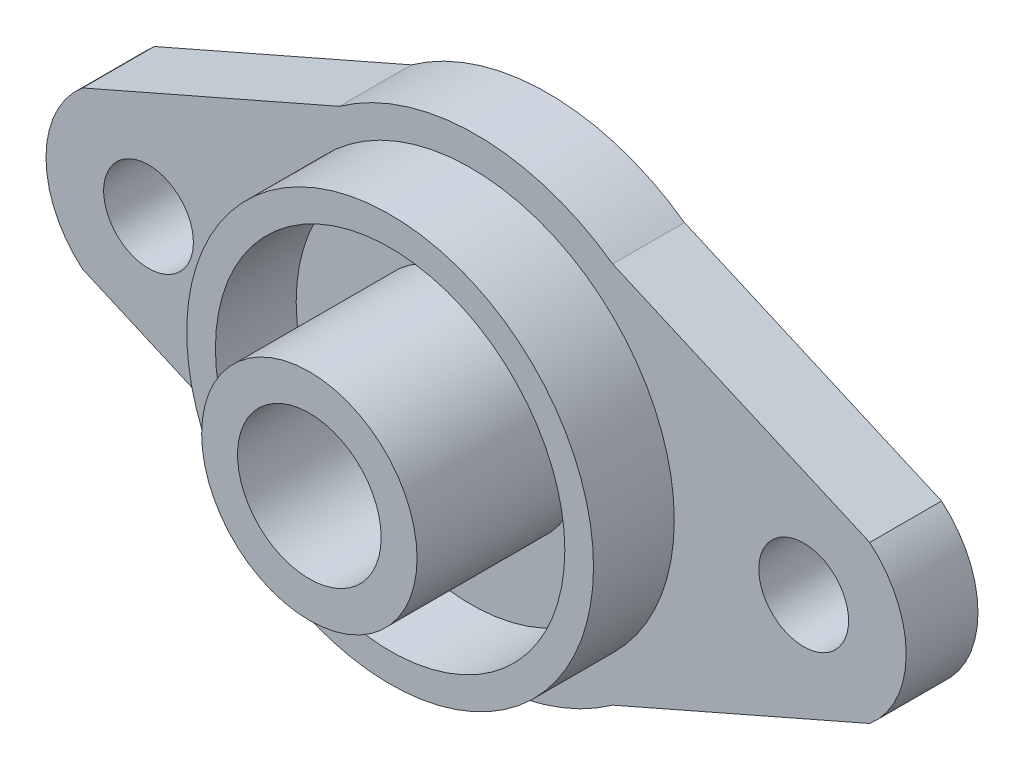
ISO-10303-21;
HEADER;
FILE_DESCRIPTION(('STEP AP214'),'2;1');
FILE_NAME('part.step','',(''),(''),'','','');
FILE_SCHEMA(('AUTOMOTIVE_DESIGN { 1 0 10303 214 1 1 1 1 }'));
ENDSEC;
DATA;
#1=APPLICATION_CONTEXT('core data for automotive mechanical design processes');
#2=APPLICATION_PROTOCOL_DEFINITION('international standard','automotive_design',2000,#1);
#3=PRODUCT_CONTEXT('',#1,'mechanical');
#4=PRODUCT('Part','Part','',(#3));
#5=PRODUCT_RELATED_PRODUCT_CATEGORY('part','',(#4));
#6=PRODUCT_DEFINITION_FORMATION('','',#4);
#7=PRODUCT_DEFINITION_CONTEXT('part definition',#1,'design');
#8=PRODUCT_DEFINITION('design','',#6,#7);
#9=PRODUCT_DEFINITION_SHAPE('','',#8);
#10=(LENGTH_UNIT() NAMED_UNIT(*) SI_UNIT(.MILLI.,.METRE.));
#11=(NAMED_UNIT(*) PLANE_ANGLE_UNIT() SI_UNIT($,.RADIAN.));
#12=(NAMED_UNIT(*) SI_UNIT($,.STERADIAN.) SOLID_ANGLE_UNIT());
#13=UNCERTAINTY_MEASURE_WITH_UNIT(LENGTH_MEASURE(1.E-05),#10,'distance_accuracy_value','');
#14=(GEOMETRIC_REPRESENTATION_CONTEXT(3) GLOBAL_UNCERTAINTY_ASSIGNED_CONTEXT((#13)) GLOBAL_UNIT_ASSIGNED_CONTEXT((#10,
#11,#12)) REPRESENTATION_CONTEXT('',''));
#15=CARTESIAN_POINT('',(0.,0.,0.));
#16=DIRECTION('',(0.,0.,1.));
#17=DIRECTION('',(1.,0.,0.));
#18=AXIS2_PLACEMENT_3D('',#15,#16,#17);
#19=CARTESIAN_POINT('',(17.9597254875254,0.,4.));
#20=DIRECTION('',(0.,0.,1.));
#21=DIRECTION('',(1.,0.,0.));
#22=AXIS2_PLACEMENT_3D('',#19,#20,#21);
#23=PLANE('',#22);
#24=CARTESIAN_POINT('',(17.9597254875254,0.,4.));
#25=DIRECTION('',(0.,0.,1.));
#26=DIRECTION('',(1.,0.,0.));
#27=AXIS2_PLACEMENT_3D('',#24,#25,#26);
#28=CIRCLE('',#27,9.73271473993538);
#29=CARTESIAN_POINT('',(27.6924402274608,0.,4.));
#30=VERTEX_POINT('',#29);
#31=EDGE_CURVE('E193',#30,#30,#28,.T.);
#32=ORIENTED_EDGE('',*,*,#31,.T.);
#33=EDGE_LOOP('',(#32));
#34=FACE_BOUND('',#33,.T.);
#35=CARTESIAN_POINT('',(17.9597254875254,0.,4.));
#36=DIRECTION('',(0.,0.,1.));
#37=DIRECTION('',(1.,0.,0.));
#38=AXIS2_PLACEMENT_3D('',#35,#36,#37);
#39=CIRCLE('',#38,6.);
#40=CARTESIAN_POINT('',(23.9597254875254,0.,4.));
#41=VERTEX_POINT('',#40);
#42=EDGE_CURVE('E202',#41,#41,#39,.T.);
#43=ORIENTED_EDGE('',*,*,#42,.F.);
#44=EDGE_LOOP('',(#43));
#45=FACE_BOUND('',#44,.T.);
#46=ADVANCED_FACE('F32',(#34,#45),#23,.T.);
#47=CARTESIAN_POINT('',(18.25,0.,4.));
#48=DIRECTION('',(0.,0.,1.));
#49=DIRECTION('',(1.,0.,0.));
#50=AXIS2_PLACEMENT_3D('',#47,#48,#49);
#51=PLANE('',#50);
#52=CARTESIAN_POINT('',(18.25,0.,4.));
#53=DIRECTION('',(0.,0.,1.));
#54=DIRECTION('',(1.,0.,0.));
#55=AXIS2_PLACEMENT_3D('',#52,#53,#54);
#56=CIRCLE('',#55,13.0815808716159);
#57=CARTESIAN_POINT('',(10.6412752182105,-10.6411966101379,4.));
#58=VERTEX_POINT('',#57);
#59=CARTESIAN_POINT('',(25.8587247817895,-10.6411966101379,4.));
#60=VERTEX_POINT('',#59);
#61=EDGE_CURVE('E145',#58,#60,#56,.T.);
#62=ORIENTED_EDGE('',*,*,#61,.T.);
#63=DIRECTION('',(0.915962279804903,0.401264379149961,0.));
#64=VECTOR('',#63,1.);
#65=CARTESIAN_POINT('',(40.1798666125582,-4.36739668175445,4.));
#66=LINE('',#65,#64);
#67=CARTESIAN_POINT('',(40.1798666125582,-4.36739668175445,4.));
#68=VERTEX_POINT('',#67);
#69=EDGE_CURVE('E92',#60,#68,#66,.T.);
#70=ORIENTED_EDGE('',*,*,#69,.T.);
#71=CARTESIAN_POINT('',(36.5,0.,4.));
#72=DIRECTION('',(0.,0.,1.));
#73=DIRECTION('',(1.,0.,0.));
#74=AXIS2_PLACEMENT_3D('',#71,#72,#73);
#75=CIRCLE('',#74,5.71100447049554);
#76=CARTESIAN_POINT('',(40.1798666125582,4.36739668175445,4.));
#77=VERTEX_POINT('',#76);
#78=EDGE_CURVE('E160',#68,#77,#75,.T.);
#79=ORIENTED_EDGE('',*,*,#78,.T.);
#80=DIRECTION('',(-0.915962279804903,0.401264379149961,0.));
#81=VECTOR('',#80,1.);
#82=CARTESIAN_POINT('',(40.1798666125582,4.36739668175445,4.));
#83=LINE('',#82,#81);
#84=CARTESIAN_POINT('',(25.8587247817895,10.6411966101379,4.));
#85=VERTEX_POINT('',#84);
#86=EDGE_CURVE('E172',#77,#85,#83,.T.);
#87=ORIENTED_EDGE('',*,*,#86,.T.);
#88=CARTESIAN_POINT('',(18.25,0.,4.));
#89=DIRECTION('',(0.,0.,1.));
#90=DIRECTION('',(-1.,0.,0.));
#91=AXIS2_PLACEMENT_3D('',#88,#89,#90);
#92=CIRCLE('',#91,13.0815808716159);
#93=CARTESIAN_POINT('',(10.6412752182105,10.6411966101379,4.));
#94=VERTEX_POINT('',#93);
#95=EDGE_CURVE('E112',#85,#94,#92,.T.);
#96=ORIENTED_EDGE('',*,*,#95,.T.);
#97=DIRECTION('',(-0.915962279804903,-0.401264379149961,0.));
#98=VECTOR('',#97,1.);
#99=CARTESIAN_POINT('',(-3.67986661255813,4.36739668175445,4.));
#100=LINE('',#99,#98);
#101=CARTESIAN_POINT('',(-3.67986661255813,4.36739668175445,4.));
#102=VERTEX_POINT('',#101);
#103=EDGE_CURVE('E105',#94,#102,#100,.T.);
#104=ORIENTED_EDGE('',*,*,#103,.T.);
#105=CARTESIAN_POINT('',(0.,0.,4.));
#106=DIRECTION('',(0.,0.,1.));
#107=DIRECTION('',(-1.,0.,0.));
#108=AXIS2_PLACEMENT_3D('',#105,#106,#107);
#109=CIRCLE('',#108,5.71100447049554);
#110=CARTESIAN_POINT('',(-3.67986661255817,-4.36739668175444,4.));
#111=VERTEX_POINT('',#110);
#112=EDGE_CURVE('E110',#102,#111,#109,.T.);
#113=ORIENTED_EDGE('',*,*,#112,.T.);
#114=DIRECTION('',(0.915962279804903,-0.401264379149961,0.));
#115=VECTOR('',#114,1.);
#116=CARTESIAN_POINT('',(-3.67986661255819,-4.36739668175445,4.));
#117=LINE('',#116,#115);
#118=EDGE_CURVE('E49',#111,#58,#117,.T.);
#119=ORIENTED_EDGE('',*,*,#118,.T.);
#120=EDGE_LOOP('',(#62,#70,#79,#87,#96,#104,#113,#119));
#121=FACE_BOUND('',#120,.T.);
#122=CARTESIAN_POINT('',(36.5,0.,4.));
#123=DIRECTION('',(0.,0.,1.));
#124=DIRECTION('',(1.,0.,0.));
#125=AXIS2_PLACEMENT_3D('',#122,#123,#124);
#126=CIRCLE('',#125,2.5);
#127=CARTESIAN_POINT('',(39.,0.,4.));
#128=VERTEX_POINT('',#127);
#129=EDGE_CURVE('E180',#128,#128,#126,.T.);
#130=ORIENTED_EDGE('',*,*,#129,.F.);
#131=EDGE_LOOP('',(#130));
#132=FACE_BOUND('',#131,.T.);
#133=CARTESIAN_POINT('',(0.,0.,4.));
#134=DIRECTION('',(0.,0.,1.));
#135=DIRECTION('',(1.,0.,0.));
#136=AXIS2_PLACEMENT_3D('',#133,#134,#135);
#137=CIRCLE('',#136,2.5);
#138=CARTESIAN_POINT('',(2.5,0.,4.));
#139=VERTEX_POINT('',#138);
#140=EDGE_CURVE('E186',#139,#139,#137,.T.);
#141=ORIENTED_EDGE('',*,*,#140,.F.);
#142=EDGE_LOOP('',(#141));
#143=FACE_BOUND('',#142,.T.);
#144=CARTESIAN_POINT('',(17.9597254875254,0.,4.));
#145=DIRECTION('',(0.,0.,1.));
#146=DIRECTION('',(1.,0.,0.));
#147=AXIS2_PLACEMENT_3D('',#144,#145,#146);
#148=CIRCLE('',#147,11.330923121912);
#149=CARTESIAN_POINT('',(29.2906486094375,0.,4.));
#150=VERTEX_POINT('',#149);
#151=EDGE_CURVE('E190',#150,#150,#148,.T.);
#152=ORIENTED_EDGE('',*,*,#151,.F.);
#153=EDGE_LOOP('',(#152));
#154=FACE_BOUND('',#153,.T.);
#155=ADVANCED_FACE('F107',(#121,#132,#143,#154),#51,.T.);
#156=CARTESIAN_POINT('',(18.25,0.,4.));
#157=DIRECTION('',(0.,0.,-1.));
#158=DIRECTION('',(-1.,0.,0.));
#159=AXIS2_PLACEMENT_3D('',#156,#157,#158);
#160=CYLINDRICAL_SURFACE('',#159,13.0815808716159);
#161=CARTESIAN_POINT('',(18.25,0.,0.));
#162=DIRECTION('',(0.,0.,1.));
#163=DIRECTION('',(1.,0.,0.));
#164=AXIS2_PLACEMENT_3D('',#161,#162,#163);
#165=CIRCLE('',#164,13.0815808716159);
#166=CARTESIAN_POINT('',(10.6412752182105,-10.6411966101379,0.));
#167=VERTEX_POINT('',#166);
#168=CARTESIAN_POINT('',(25.8587247817895,-10.6411966101379,0.));
#169=VERTEX_POINT('',#168);
#170=EDGE_CURVE('E130',#167,#169,#165,.T.);
#171=ORIENTED_EDGE('',*,*,#170,.T.);
#172=DIRECTION('',(0.,0.,-1.));
#173=VECTOR('',#172,1.);
#174=CARTESIAN_POINT('',(25.8587247817895,-10.6411966101379,4.));
#175=LINE('',#174,#173);
#176=EDGE_CURVE('E11',#60,#169,#175,.T.);
#177=ORIENTED_EDGE('',*,*,#176,.F.);
#178=ORIENTED_EDGE('',*,*,#61,.F.);
#179=DIRECTION('',(0.,0.,-1.));
#180=VECTOR('',#179,1.);
#181=CARTESIAN_POINT('',(10.6412752182105,-10.6411966101379,4.));
#182=LINE('',#181,#180);
#183=EDGE_CURVE('E126',#58,#167,#182,.T.);
#184=ORIENTED_EDGE('',*,*,#183,.T.);
#185=EDGE_LOOP('',(#171,#177,#178,#184));
#186=FACE_BOUND('',#185,.T.);
#187=ADVANCED_FACE('F34',(#186),#160,.T.);
#188=CARTESIAN_POINT('',(40.1798666125582,-4.36739668175445,4.));
#189=DIRECTION('',(-0.401264379149961,0.915962279804903,0.));
#190=DIRECTION('',(-0.915962279804904,-0.401264379149961,0.));
#191=AXIS2_PLACEMENT_3D('',#188,#189,#190);
#192=PLANE('',#191);
#193=DIRECTION('',(0.915962279804903,0.401264379149961,0.));
#194=VECTOR('',#193,1.);
#195=CARTESIAN_POINT('',(40.1798666125582,-4.36739668175445,0.));
#196=LINE('',#195,#194);
#197=CARTESIAN_POINT('',(40.1798666125582,-4.36739668175445,0.));
#198=VERTEX_POINT('',#197);
#199=EDGE_CURVE('E133',#169,#198,#196,.T.);
#200=ORIENTED_EDGE('',*,*,#199,.T.);
#201=DIRECTION('',(0.,0.,-1.));
#202=VECTOR('',#201,1.);
#203=CARTESIAN_POINT('',(40.1798666125582,-4.36739668175445,4.));
#204=LINE('',#203,#202);
#205=EDGE_CURVE('E41',#68,#198,#204,.T.);
#206=ORIENTED_EDGE('',*,*,#205,.F.);
#207=ORIENTED_EDGE('',*,*,#69,.F.);
#208=ORIENTED_EDGE('',*,*,#176,.T.);
#209=EDGE_LOOP('',(#200,#206,#207,#208));
#210=FACE_BOUND('',#209,.T.);
#211=ADVANCED_FACE('F276',(#210),#192,.F.);
#212=CARTESIAN_POINT('',(36.5,0.,4.));
#213=DIRECTION('',(0.,0.,-1.));
#214=DIRECTION('',(-1.,0.,0.));
#215=AXIS2_PLACEMENT_3D('',#212,#213,#214);
#216=CYLINDRICAL_SURFACE('',#215,5.71100447049554);
#217=CARTESIAN_POINT('',(36.5,0.,0.));
#218=DIRECTION('',(0.,0.,1.));
#219=DIRECTION('',(1.,0.,0.));
#220=AXIS2_PLACEMENT_3D('',#217,#218,#219);
#221=CIRCLE('',#220,5.71100447049554);
#222=CARTESIAN_POINT('',(40.1798666125582,4.36739668175445,0.));
#223=VERTEX_POINT('',#222);
#224=EDGE_CURVE('E136',#198,#223,#221,.T.);
#225=ORIENTED_EDGE('',*,*,#224,.T.);
#226=DIRECTION('',(0.,0.,-1.));
#227=VECTOR('',#226,1.);
#228=CARTESIAN_POINT('',(40.1798666125582,4.36739668175445,4.));
#229=LINE('',#228,#227);
#230=EDGE_CURVE('E152',#77,#223,#229,.T.);
#231=ORIENTED_EDGE('',*,*,#230,.F.);
#232=ORIENTED_EDGE('',*,*,#78,.F.);
#233=ORIENTED_EDGE('',*,*,#205,.T.);
#234=EDGE_LOOP('',(#225,#231,#232,#233));
#235=FACE_BOUND('',#234,.T.);
#236=ADVANCED_FACE('F158',(#235),#216,.T.);
#237=CARTESIAN_POINT('',(40.1798666125582,4.36739668175445,4.));
#238=DIRECTION('',(-0.401264379149961,-0.915962279804903,0.));
#239=DIRECTION('',(0.915962279804904,-0.401264379149961,0.));
#240=AXIS2_PLACEMENT_3D('',#237,#238,#239);
#241=PLANE('',#240);
#242=DIRECTION('',(-0.915962279804903,0.401264379149961,0.));
#243=VECTOR('',#242,1.);
#244=CARTESIAN_POINT('',(40.1798666125582,4.36739668175445,0.));
#245=LINE('',#244,#243);
#246=CARTESIAN_POINT('',(25.8587247817895,10.6411966101379,0.));
#247=VERTEX_POINT('',#246);
#248=EDGE_CURVE('E138',#223,#247,#245,.T.);
#249=ORIENTED_EDGE('',*,*,#248,.T.);
#250=DIRECTION('',(0.,0.,-1.));
#251=VECTOR('',#250,1.);
#252=CARTESIAN_POINT('',(25.8587247817895,10.6411966101379,4.));
#253=LINE('',#252,#251);
#254=EDGE_CURVE('E149',#85,#247,#253,.T.);
#255=ORIENTED_EDGE('',*,*,#254,.F.);
#256=ORIENTED_EDGE('',*,*,#86,.F.);
#257=ORIENTED_EDGE('',*,*,#230,.T.);
#258=EDGE_LOOP('',(#249,#255,#256,#257));
#259=FACE_BOUND('',#258,.T.);
#260=ADVANCED_FACE('F168',(#259),#241,.F.);
#261=CARTESIAN_POINT('',(18.25,0.,4.));
#262=DIRECTION('',(0.,0.,-1.));
#263=DIRECTION('',(-1.,0.,0.));
#264=AXIS2_PLACEMENT_3D('',#261,#262,#263);
#265=CYLINDRICAL_SURFACE('',#264,13.0815808716159);
#266=CARTESIAN_POINT('',(18.25,0.,0.));
#267=DIRECTION('',(0.,0.,1.));
#268=DIRECTION('',(-1.,0.,0.));
#269=AXIS2_PLACEMENT_3D('',#266,#267,#268);
#270=CIRCLE('',#269,13.0815808716159);
#271=CARTESIAN_POINT('',(10.6412752182105,10.6411966101379,0.));
#272=VERTEX_POINT('',#271);
#273=EDGE_CURVE('E140',#247,#272,#270,.T.);
#274=ORIENTED_EDGE('',*,*,#273,.T.);
#275=DIRECTION('',(0.,0.,-1.));
#276=VECTOR('',#275,1.);
#277=CARTESIAN_POINT('',(10.6412752182105,10.6411966101379,4.));
#278=LINE('',#277,#276);
#279=EDGE_CURVE('E121',#94,#272,#278,.T.);
#280=ORIENTED_EDGE('',*,*,#279,.F.);
#281=ORIENTED_EDGE('',*,*,#95,.F.);
#282=ORIENTED_EDGE('',*,*,#254,.T.);
#283=EDGE_LOOP('',(#274,#280,#281,#282));
#284=FACE_BOUND('',#283,.T.);
#285=ADVANCED_FACE('F171',(#284),#265,.T.);
#286=CARTESIAN_POINT('',(-3.67986661255813,4.36739668175445,4.));
#287=DIRECTION('',(0.401264379149961,-0.915962279804903,0.));
#288=DIRECTION('',(0.915962279804903,0.401264379149961,0.));
#289=AXIS2_PLACEMENT_3D('',#286,#287,#288);
#290=PLANE('',#289);
#291=DIRECTION('',(-0.915962279804903,-0.401264379149961,0.));
#292=VECTOR('',#291,1.);
#293=CARTESIAN_POINT('',(-3.67986661255813,4.36739668175445,0.));
#294=LINE('',#293,#292);
#295=CARTESIAN_POINT('',(-3.67986661255813,4.36739668175445,0.));
#296=VERTEX_POINT('',#295);
#297=EDGE_CURVE('E120',#272,#296,#294,.T.);
#298=ORIENTED_EDGE('',*,*,#297,.T.);
#299=DIRECTION('',(0.,0.,-1.));
#300=VECTOR('',#299,1.);
#301=CARTESIAN_POINT('',(-3.67986661255813,4.36739668175445,4.));
#302=LINE('',#301,#300);
#303=EDGE_CURVE('E117',#102,#296,#302,.T.);
#304=ORIENTED_EDGE('',*,*,#303,.F.);
#305=ORIENTED_EDGE('',*,*,#103,.F.);
#306=ORIENTED_EDGE('',*,*,#279,.T.);
#307=EDGE_LOOP('',(#298,#304,#305,#306));
#308=FACE_BOUND('',#307,.T.);
#309=ADVANCED_FACE('F118',(#308),#290,.F.);
#310=CARTESIAN_POINT('',(0.,0.,4.));
#311=DIRECTION('',(0.,0.,-1.));
#312=DIRECTION('',(-1.,0.,0.));
#313=AXIS2_PLACEMENT_3D('',#310,#311,#312);
#314=CYLINDRICAL_SURFACE('',#313,5.71100447049554);
#315=CARTESIAN_POINT('',(0.,0.,0.));
#316=DIRECTION('',(0.,0.,1.));
#317=DIRECTION('',(-1.,0.,0.));
#318=AXIS2_PLACEMENT_3D('',#315,#316,#317);
#319=CIRCLE('',#318,5.71100447049554);
#320=CARTESIAN_POINT('',(-3.67986661255817,-4.36739668175444,0.));
#321=VERTEX_POINT('',#320);
#322=EDGE_CURVE('E78',#296,#321,#319,.T.);
#323=ORIENTED_EDGE('',*,*,#322,.T.);
#324=DIRECTION('',(0.,0.,-1.));
#325=VECTOR('',#324,1.);
#326=CARTESIAN_POINT('',(-3.67986661255817,-4.36739668175444,4.));
#327=LINE('',#326,#325);
#328=EDGE_CURVE('E122',#111,#321,#327,.T.);
#329=ORIENTED_EDGE('',*,*,#328,.F.);
#330=ORIENTED_EDGE('',*,*,#112,.F.);
#331=ORIENTED_EDGE('',*,*,#303,.T.);
#332=EDGE_LOOP('',(#323,#329,#330,#331));
#333=FACE_BOUND('',#332,.T.);
#334=ADVANCED_FACE('F124',(#333),#314,.T.);
#335=CARTESIAN_POINT('',(-3.67986661255819,-4.36739668175445,4.));
#336=DIRECTION('',(0.401264379149961,0.915962279804903,0.));
#337=DIRECTION('',(-0.915962279804903,0.401264379149961,0.));
#338=AXIS2_PLACEMENT_3D('',#335,#336,#337);
#339=PLANE('',#338);
#340=DIRECTION('',(0.915962279804903,-0.401264379149961,0.));
#341=VECTOR('',#340,1.);
#342=CARTESIAN_POINT('',(-3.67986661255819,-4.36739668175445,0.));
#343=LINE('',#342,#341);
#344=EDGE_CURVE('E84',#321,#167,#343,.T.);
#345=ORIENTED_EDGE('',*,*,#344,.T.);
#346=ORIENTED_EDGE('',*,*,#183,.F.);
#347=ORIENTED_EDGE('',*,*,#118,.F.);
#348=ORIENTED_EDGE('',*,*,#328,.T.);
#349=EDGE_LOOP('',(#345,#346,#347,#348));
#350=FACE_BOUND('',#349,.T.);
#351=ADVANCED_FACE('F264',(#350),#339,.F.);
#352=CARTESIAN_POINT('',(18.25,0.,0.));
#353=DIRECTION('',(0.,0.,1.));
#354=DIRECTION('',(1.,0.,0.));
#355=AXIS2_PLACEMENT_3D('',#352,#353,#354);
#356=PLANE('',#355);
#357=CARTESIAN_POINT('',(17.9597254875254,0.,0.));
#358=DIRECTION('',(0.,0.,1.));
#359=DIRECTION('',(1.,0.,0.));
#360=AXIS2_PLACEMENT_3D('',#357,#358,#359);
#361=CIRCLE('',#360,4.);
#362=CARTESIAN_POINT('',(21.9597254875254,0.,0.));
#363=VERTEX_POINT('',#362);
#364=EDGE_CURVE('E205',#363,#363,#361,.T.);
#365=ORIENTED_EDGE('',*,*,#364,.T.);
#366=EDGE_LOOP('',(#365));
#367=FACE_BOUND('',#366,.T.);
#368=CARTESIAN_POINT('',(0.,0.,0.));
#369=DIRECTION('',(0.,0.,1.));
#370=DIRECTION('',(1.,0.,0.));
#371=AXIS2_PLACEMENT_3D('',#368,#369,#370);
#372=CIRCLE('',#371,2.5);
#373=CARTESIAN_POINT('',(2.5,0.,0.));
#374=VERTEX_POINT('',#373);
#375=EDGE_CURVE('E183',#374,#374,#372,.T.);
#376=ORIENTED_EDGE('',*,*,#375,.T.);
#377=EDGE_LOOP('',(#376));
#378=FACE_BOUND('',#377,.T.);
#379=CARTESIAN_POINT('',(36.5,0.,0.));
#380=DIRECTION('',(0.,0.,1.));
#381=DIRECTION('',(1.,0.,0.));
#382=AXIS2_PLACEMENT_3D('',#379,#380,#381);
#383=CIRCLE('',#382,2.5);
#384=CARTESIAN_POINT('',(39.,0.,0.));
#385=VERTEX_POINT('',#384);
#386=EDGE_CURVE('E134',#385,#385,#383,.T.);
#387=ORIENTED_EDGE('',*,*,#386,.T.);
#388=EDGE_LOOP('',(#387));
#389=FACE_BOUND('',#388,.T.);
#390=ORIENTED_EDGE('',*,*,#170,.F.);
#391=ORIENTED_EDGE('',*,*,#344,.F.);
#392=ORIENTED_EDGE('',*,*,#322,.F.);
#393=ORIENTED_EDGE('',*,*,#297,.F.);
#394=ORIENTED_EDGE('',*,*,#273,.F.);
#395=ORIENTED_EDGE('',*,*,#248,.F.);
#396=ORIENTED_EDGE('',*,*,#224,.F.);
#397=ORIENTED_EDGE('',*,*,#199,.F.);
#398=EDGE_LOOP('',(#390,#391,#392,#393,#394,#395,#396,#397));
#399=FACE_BOUND('',#398,.T.);
#400=ADVANCED_FACE('F164',(#367,#378,#389,#399),#356,.F.);
#401=CARTESIAN_POINT('',(36.5,0.,4.));
#402=DIRECTION('',(0.,0.,1.));
#403=DIRECTION('',(1.,0.,0.));
#404=AXIS2_PLACEMENT_3D('',#401,#402,#403);
#405=CYLINDRICAL_SURFACE('',#404,2.5);
#406=ORIENTED_EDGE('',*,*,#386,.F.);
#407=EDGE_LOOP('',(#406));
#408=FACE_BOUND('',#407,.T.);
#409=ORIENTED_EDGE('',*,*,#129,.T.);
#410=EDGE_LOOP('',(#409));
#411=FACE_BOUND('',#410,.T.);
#412=ADVANCED_FACE('F257',(#408,#411),#405,.F.);
#413=CARTESIAN_POINT('',(0.,0.,4.));
#414=DIRECTION('',(0.,0.,1.));
#415=DIRECTION('',(1.,0.,0.));
#416=AXIS2_PLACEMENT_3D('',#413,#414,#415);
#417=CYLINDRICAL_SURFACE('',#416,2.5);
#418=ORIENTED_EDGE('',*,*,#375,.F.);
#419=EDGE_LOOP('',(#418));
#420=FACE_BOUND('',#419,.T.);
#421=ORIENTED_EDGE('',*,*,#140,.T.);
#422=EDGE_LOOP('',(#421));
#423=FACE_BOUND('',#422,.T.);
#424=ADVANCED_FACE('F253',(#420,#423),#417,.F.);
#425=CARTESIAN_POINT('',(17.9597254875254,0.,8.5));
#426=DIRECTION('',(0.,0.,-1.));
#427=DIRECTION('',(-1.,0.,0.));
#428=AXIS2_PLACEMENT_3D('',#425,#426,#427);
#429=CYLINDRICAL_SURFACE('',#428,11.330923121912);
#430=CARTESIAN_POINT('',(17.9597254875254,0.,8.5));
#431=DIRECTION('',(0.,0.,1.));
#432=DIRECTION('',(1.,0.,0.));
#433=AXIS2_PLACEMENT_3D('',#430,#431,#432);
#434=CIRCLE('',#433,11.330923121912);
#435=CARTESIAN_POINT('',(29.2906486094375,0.,8.5));
#436=VERTEX_POINT('',#435);
#437=EDGE_CURVE('E189',#436,#436,#434,.T.);
#438=ORIENTED_EDGE('',*,*,#437,.F.);
#439=EDGE_LOOP('',(#438));
#440=FACE_BOUND('',#439,.T.);
#441=ORIENTED_EDGE('',*,*,#151,.T.);
#442=EDGE_LOOP('',(#441));
#443=FACE_BOUND('',#442,.T.);
#444=ADVANCED_FACE('F249',(#440,#443),#429,.T.);
#445=CARTESIAN_POINT('',(17.9597254875254,0.,8.5));
#446=DIRECTION('',(0.,0.,1.));
#447=DIRECTION('',(1.,0.,0.));
#448=AXIS2_PLACEMENT_3D('',#445,#446,#447);
#449=PLANE('',#448);
#450=CARTESIAN_POINT('',(17.9597254875254,0.,8.5));
#451=DIRECTION('',(0.,0.,1.));
#452=DIRECTION('',(1.,0.,0.));
#453=AXIS2_PLACEMENT_3D('',#450,#451,#452);
#454=CIRCLE('',#453,9.73271473993538);
#455=CARTESIAN_POINT('',(27.6924402274608,0.,8.5));
#456=VERTEX_POINT('',#455);
#457=EDGE_CURVE('E196',#456,#456,#454,.T.);
#458=ORIENTED_EDGE('',*,*,#457,.F.);
#459=EDGE_LOOP('',(#458));
#460=FACE_BOUND('',#459,.T.);
#461=ORIENTED_EDGE('',*,*,#437,.T.);
#462=EDGE_LOOP('',(#461));
#463=FACE_BOUND('',#462,.T.);
#464=ADVANCED_FACE('F245',(#460,#463),#449,.T.);
#465=CARTESIAN_POINT('',(17.9597254875254,0.,4.));
#466=DIRECTION('',(0.,0.,1.));
#467=DIRECTION('',(1.,0.,0.));
#468=AXIS2_PLACEMENT_3D('',#465,#466,#467);
#469=CYLINDRICAL_SURFACE('',#468,9.73271473993538);
#470=ORIENTED_EDGE('',*,*,#31,.F.);
#471=EDGE_LOOP('',(#470));
#472=FACE_BOUND('',#471,.T.);
#473=ORIENTED_EDGE('',*,*,#457,.T.);
#474=EDGE_LOOP('',(#473));
#475=FACE_BOUND('',#474,.T.);
#476=ADVANCED_FACE('F231',(#472,#475),#469,.F.);
#477=CARTESIAN_POINT('',(17.9597254875254,0.,13.));
#478=DIRECTION('',(0.,0.,-1.));
#479=DIRECTION('',(-1.,0.,0.));
#480=AXIS2_PLACEMENT_3D('',#477,#478,#479);
#481=CYLINDRICAL_SURFACE('',#480,6.);
#482=CARTESIAN_POINT('',(17.9597254875254,0.,13.));
#483=DIRECTION('',(0.,0.,1.));
#484=DIRECTION('',(1.,0.,0.));
#485=AXIS2_PLACEMENT_3D('',#482,#483,#484);
#486=CIRCLE('',#485,6.);
#487=CARTESIAN_POINT('',(23.9597254875254,0.,13.));
#488=VERTEX_POINT('',#487);
#489=EDGE_CURVE('E199',#488,#488,#486,.T.);
#490=ORIENTED_EDGE('',*,*,#489,.F.);
#491=EDGE_LOOP('',(#490));
#492=FACE_BOUND('',#491,.T.);
#493=ORIENTED_EDGE('',*,*,#42,.T.);
#494=EDGE_LOOP('',(#493));
#495=FACE_BOUND('',#494,.T.);
#496=ADVANCED_FACE('F225',(#492,#495),#481,.T.);
#497=CARTESIAN_POINT('',(17.9597254875254,0.,13.));
#498=DIRECTION('',(0.,0.,1.));
#499=DIRECTION('',(1.,0.,0.));
#500=AXIS2_PLACEMENT_3D('',#497,#498,#499);
#501=PLANE('',#500);
#502=CARTESIAN_POINT('',(17.9597254875254,0.,13.));
#503=DIRECTION('',(0.,0.,1.));
#504=DIRECTION('',(1.,0.,0.));
#505=AXIS2_PLACEMENT_3D('',#502,#503,#504);
#506=CIRCLE('',#505,4.);
#507=CARTESIAN_POINT('',(21.9597254875254,0.,13.));
#508=VERTEX_POINT('',#507);
#509=EDGE_CURVE('E208',#508,#508,#506,.T.);
#510=ORIENTED_EDGE('',*,*,#509,.F.);
#511=EDGE_LOOP('',(#510));
#512=FACE_BOUND('',#511,.T.);
#513=ORIENTED_EDGE('',*,*,#489,.T.);
#514=EDGE_LOOP('',(#513));
#515=FACE_BOUND('',#514,.T.);
#516=ADVANCED_FACE('F219',(#512,#515),#501,.T.);
#517=CARTESIAN_POINT('',(17.9597254875254,0.,0.));
#518=DIRECTION('',(0.,0.,1.));
#519=DIRECTION('',(1.,0.,0.));
#520=AXIS2_PLACEMENT_3D('',#517,#518,#519);
#521=CYLINDRICAL_SURFACE('',#520,4.);
#522=ORIENTED_EDGE('',*,*,#364,.F.);
#523=EDGE_LOOP('',(#522));
#524=FACE_BOUND('',#523,.T.);
#525=ORIENTED_EDGE('',*,*,#509,.T.);
#526=EDGE_LOOP('',(#525));
#527=FACE_BOUND('',#526,.T.);
#528=ADVANCED_FACE('F216',(#524,#527),#521,.F.);
#529=CLOSED_SHELL('',(#46,#155,#187,#211,#236,#260,#285,#309,#334,#351,#400,#412,#424,#444,#464,
#476,#496,#516,#528));
#530=MANIFOLD_SOLID_BREP('B2',#529);
#531=ADVANCED_BREP_SHAPE_REPRESENTATION('',(#18,#530),#14);
#532=SHAPE_DEFINITION_REPRESENTATION(#9,#531);
ENDSEC;
END-ISO-10303-21;
